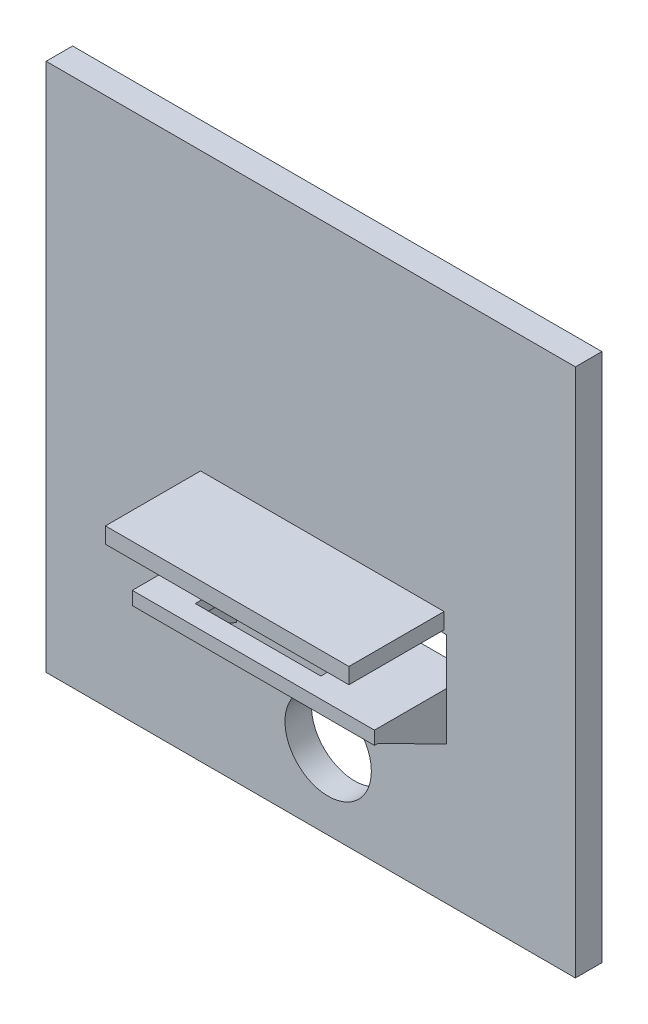
ISO-10303-21;
HEADER;
FILE_DESCRIPTION(('STEP AP214'),'2;1');
FILE_NAME('part.step','',(''),(''),'','','');
FILE_SCHEMA(('AUTOMOTIVE_DESIGN { 1 0 10303 214 1 1 1 1 }'));
ENDSEC;
DATA;
#1=APPLICATION_CONTEXT('core data for automotive mechanical design processes');
#2=APPLICATION_PROTOCOL_DEFINITION('international standard','automotive_design',2000,#1);
#3=PRODUCT_CONTEXT('',#1,'mechanical');
#4=PRODUCT('Part','Part','',(#3));
#5=PRODUCT_RELATED_PRODUCT_CATEGORY('part','',(#4));
#6=PRODUCT_DEFINITION_FORMATION('','',#4);
#7=PRODUCT_DEFINITION_CONTEXT('part definition',#1,'design');
#8=PRODUCT_DEFINITION('design','',#6,#7);
#9=PRODUCT_DEFINITION_SHAPE('','',#8);
#10=(LENGTH_UNIT() NAMED_UNIT(*) SI_UNIT(.MILLI.,.METRE.));
#11=(NAMED_UNIT(*) PLANE_ANGLE_UNIT() SI_UNIT($,.RADIAN.));
#12=(NAMED_UNIT(*) SI_UNIT($,.STERADIAN.) SOLID_ANGLE_UNIT());
#13=UNCERTAINTY_MEASURE_WITH_UNIT(LENGTH_MEASURE(1.E-05),#10,'distance_accuracy_value','');
#14=(GEOMETRIC_REPRESENTATION_CONTEXT(3) GLOBAL_UNCERTAINTY_ASSIGNED_CONTEXT((#13)) GLOBAL_UNIT_ASSIGNED_CONTEXT((#10,
#11,#12)) REPRESENTATION_CONTEXT('',''));
#15=CARTESIAN_POINT('',(0.,0.,0.));
#16=DIRECTION('',(0.,0.,1.));
#17=DIRECTION('',(1.,0.,0.));
#18=AXIS2_PLACEMENT_3D('',#15,#16,#17);
#19=CARTESIAN_POINT('',(151.640450248194,-27.3694719299466,11.2693926939187));
#20=DIRECTION('',(-1.,0.,0.));
#21=DIRECTION('',(0.,0.,1.));
#22=AXIS2_PLACEMENT_3D('',#19,#20,#21);
#23=PLANE('',#22);
#24=DIRECTION('',(0.,0.,-1.));
#25=VECTOR('',#24,1.);
#26=CARTESIAN_POINT('',(151.640450248194,-33.3694719299466,11.2693926939187));
#27=LINE('',#26,#25);
#28=CARTESIAN_POINT('',(151.640450248194,-33.3694719299466,47.2328803838877));
#29=VERTEX_POINT('',#28);
#30=CARTESIAN_POINT('',(151.640450248194,-33.3694719299466,11.2693926939187));
#31=VERTEX_POINT('',#30);
#32=EDGE_CURVE('E118',#29,#31,#27,.T.);
#33=ORIENTED_EDGE('',*,*,#32,.T.);
#34=DIRECTION('',(0.,-1.,0.));
#35=VECTOR('',#34,1.);
#36=CARTESIAN_POINT('',(151.640450248194,-27.3694719299466,11.2693926939187));
#37=LINE('',#36,#35);
#38=CARTESIAN_POINT('',(151.640450248194,-27.3694719299466,11.2693926939187));
#39=VERTEX_POINT('',#38);
#40=EDGE_CURVE('E12',#39,#31,#37,.T.);
#41=ORIENTED_EDGE('',*,*,#40,.F.);
#42=DIRECTION('',(0.,0.,-1.));
#43=VECTOR('',#42,1.);
#44=CARTESIAN_POINT('',(151.640450248194,-27.3694719299466,11.2693926939187));
#45=LINE('',#44,#43);
#46=CARTESIAN_POINT('',(151.640450248194,-27.3694719299466,47.2328803838877));
#47=VERTEX_POINT('',#46);
#48=EDGE_CURVE('E106',#47,#39,#45,.T.);
#49=ORIENTED_EDGE('',*,*,#48,.F.);
#50=DIRECTION('',(0.,-1.,0.));
#51=VECTOR('',#50,1.);
#52=CARTESIAN_POINT('',(151.640450248194,-27.3694719299466,47.2328803838877));
#53=LINE('',#52,#51);
#54=EDGE_CURVE('E114',#47,#29,#53,.T.);
#55=ORIENTED_EDGE('',*,*,#54,.T.);
#56=EDGE_LOOP('',(#33,#41,#49,#55));
#57=FACE_BOUND('',#56,.T.);
#58=ADVANCED_FACE('F55',(#57),#23,.F.);
#59=CARTESIAN_POINT('',(151.640450248194,-27.3694719299466,11.2693926939187));
#60=DIRECTION('',(0.,0.,1.));
#61=DIRECTION('',(1.,0.,0.));
#62=AXIS2_PLACEMENT_3D('',#59,#60,#61);
#63=PLANE('',#62);
#64=DIRECTION('',(-1.,0.,0.));
#65=VECTOR('',#64,1.);
#66=CARTESIAN_POINT('',(151.640450248194,-33.3694719299466,11.2693926939187));
#67=LINE('',#66,#65);
#68=CARTESIAN_POINT('',(59.6402535033151,-33.3694719299466,11.2693926939187));
#69=VERTEX_POINT('',#68);
#70=EDGE_CURVE('E110',#31,#69,#67,.T.);
#71=ORIENTED_EDGE('',*,*,#70,.T.);
#72=DIRECTION('',(0.,-1.,0.));
#73=VECTOR('',#72,1.);
#74=CARTESIAN_POINT('',(59.6402535033151,-27.3694719299466,11.2693926939187));
#75=LINE('',#74,#73);
#76=CARTESIAN_POINT('',(59.6402535033151,-27.3694719299466,11.2693926939187));
#77=VERTEX_POINT('',#76);
#78=EDGE_CURVE('E63',#77,#69,#75,.T.);
#79=ORIENTED_EDGE('',*,*,#78,.F.);
#80=DIRECTION('',(-1.,0.,0.));
#81=VECTOR('',#80,1.);
#82=CARTESIAN_POINT('',(151.640450248194,-27.3694719299466,11.2693926939187));
#83=LINE('',#82,#81);
#84=EDGE_CURVE('E101',#39,#77,#83,.T.);
#85=ORIENTED_EDGE('',*,*,#84,.F.);
#86=ORIENTED_EDGE('',*,*,#40,.T.);
#87=EDGE_LOOP('',(#71,#79,#85,#86));
#88=FACE_BOUND('',#87,.T.);
#89=ADVANCED_FACE('F109',(#88),#63,.F.);
#90=CARTESIAN_POINT('',(59.6402535033151,-27.3694719299466,11.2693926939187));
#91=DIRECTION('',(1.,0.,0.));
#92=DIRECTION('',(0.,0.,-1.));
#93=AXIS2_PLACEMENT_3D('',#90,#91,#92);
#94=PLANE('',#93);
#95=DIRECTION('',(0.,0.,1.));
#96=VECTOR('',#95,1.);
#97=CARTESIAN_POINT('',(59.6402535033151,-33.3694719299466,11.2693926939187));
#98=LINE('',#97,#96);
#99=CARTESIAN_POINT('',(59.6402535033151,-33.3694719299466,47.2328803838877));
#100=VERTEX_POINT('',#99);
#101=EDGE_CURVE('E88',#69,#100,#98,.T.);
#102=ORIENTED_EDGE('',*,*,#101,.T.);
#103=DIRECTION('',(0.,-1.,0.));
#104=VECTOR('',#103,1.);
#105=CARTESIAN_POINT('',(59.6402535033151,-27.3694719299466,47.2328803838877));
#106=LINE('',#105,#104);
#107=CARTESIAN_POINT('',(59.6402535033151,-27.3694719299466,47.2328803838877));
#108=VERTEX_POINT('',#107);
#109=EDGE_CURVE('E111',#108,#100,#106,.T.);
#110=ORIENTED_EDGE('',*,*,#109,.F.);
#111=DIRECTION('',(0.,0.,1.));
#112=VECTOR('',#111,1.);
#113=CARTESIAN_POINT('',(59.6402535033151,-27.3694719299466,11.2693926939187));
#114=LINE('',#113,#112);
#115=EDGE_CURVE('E104',#77,#108,#114,.T.);
#116=ORIENTED_EDGE('',*,*,#115,.F.);
#117=ORIENTED_EDGE('',*,*,#78,.T.);
#118=EDGE_LOOP('',(#102,#110,#116,#117));
#119=FACE_BOUND('',#118,.T.);
#120=ADVANCED_FACE('F112',(#119),#94,.F.);
#121=CARTESIAN_POINT('',(151.640450248194,-27.3694719299466,47.2328803838877));
#122=DIRECTION('',(0.,0.,-1.));
#123=DIRECTION('',(-1.,0.,0.));
#124=AXIS2_PLACEMENT_3D('',#121,#122,#123);
#125=PLANE('',#124);
#126=DIRECTION('',(1.,0.,0.));
#127=VECTOR('',#126,1.);
#128=CARTESIAN_POINT('',(151.640450248194,-33.3694719299466,47.2328803838877));
#129=LINE('',#128,#127);
#130=EDGE_CURVE('E94',#100,#29,#129,.T.);
#131=ORIENTED_EDGE('',*,*,#130,.T.);
#132=ORIENTED_EDGE('',*,*,#54,.F.);
#133=DIRECTION('',(1.,0.,0.));
#134=VECTOR('',#133,1.);
#135=CARTESIAN_POINT('',(151.640450248194,-27.3694719299466,47.2328803838877));
#136=LINE('',#135,#134);
#137=EDGE_CURVE('E71',#108,#47,#136,.T.);
#138=ORIENTED_EDGE('',*,*,#137,.F.);
#139=ORIENTED_EDGE('',*,*,#109,.T.);
#140=EDGE_LOOP('',(#131,#132,#138,#139));
#141=FACE_BOUND('',#140,.T.);
#142=ADVANCED_FACE('F125',(#141),#125,.F.);
#143=CARTESIAN_POINT('',(0.,-27.3694719299466,0.));
#144=DIRECTION('',(0.,-1.,0.));
#145=DIRECTION('',(0.,0.,-1.));
#146=AXIS2_PLACEMENT_3D('',#143,#144,#145);
#147=PLANE('',#146);
#148=ORIENTED_EDGE('',*,*,#48,.T.);
#149=ORIENTED_EDGE('',*,*,#84,.T.);
#150=ORIENTED_EDGE('',*,*,#115,.T.);
#151=ORIENTED_EDGE('',*,*,#137,.T.);
#152=EDGE_LOOP('',(#148,#149,#150,#151));
#153=FACE_BOUND('',#152,.T.);
#154=ADVANCED_FACE('F102',(#153),#147,.F.);
#155=CARTESIAN_POINT('',(0.,-33.3694719299466,0.));
#156=DIRECTION('',(0.,-1.,0.));
#157=DIRECTION('',(0.,0.,-1.));
#158=AXIS2_PLACEMENT_3D('',#155,#156,#157);
#159=PLANE('',#158);
#160=ORIENTED_EDGE('',*,*,#32,.F.);
#161=ORIENTED_EDGE('',*,*,#130,.F.);
#162=ORIENTED_EDGE('',*,*,#101,.F.);
#163=ORIENTED_EDGE('',*,*,#70,.F.);
#164=EDGE_LOOP('',(#160,#161,#162,#163));
#165=FACE_BOUND('',#164,.T.);
#166=ADVANCED_FACE('F128',(#165),#159,.T.);
#167=CLOSED_SHELL('',(#58,#89,#120,#142,#154,#166));
#168=MANIFOLD_SOLID_BREP('B2',#167);
#169=CARTESIAN_POINT('',(0.,0.,10.));
#170=DIRECTION('',(0.,0.,1.));
#171=DIRECTION('',(1.,0.,0.));
#172=AXIS2_PLACEMENT_3D('',#169,#170,#171);
#173=PLANE('',#172);
#174=DIRECTION('',(0.,1.,0.));
#175=VECTOR('',#174,1.);
#176=CARTESIAN_POINT('',(139.307336770756,-71.5705828269948,10.));
#177=LINE('',#176,#175);
#178=CARTESIAN_POINT('',(139.307336770756,-71.5705828269948,10.));
#179=VERTEX_POINT('',#178);
#180=CARTESIAN_POINT('',(139.307336770756,-58.3694719299466,10.));
#181=VERTEX_POINT('',#180);
#182=EDGE_CURVE('E336',#179,#181,#177,.T.);
#183=ORIENTED_EDGE('',*,*,#182,.T.);
#184=DIRECTION('',(1.,0.,0.));
#185=VECTOR('',#184,1.);
#186=CARTESIAN_POINT('',(59.8073367707563,-58.3694719299466,10.));
#187=LINE('',#186,#185);
#188=CARTESIAN_POINT('',(71.8455262629195,-58.3694719299466,10.));
#189=VERTEX_POINT('',#188);
#190=EDGE_CURVE('E318',#189,#181,#187,.T.);
#191=ORIENTED_EDGE('',*,*,#190,.F.);
#192=DIRECTION('',(0.,-1.,0.));
#193=VECTOR('',#192,1.);
#194=CARTESIAN_POINT('',(71.8455262629195,-71.5705828269948,10.));
#195=LINE('',#194,#193);
#196=CARTESIAN_POINT('',(71.8455262629195,-71.5705828269948,10.));
#197=VERTEX_POINT('',#196);
#198=EDGE_CURVE('E347',#189,#197,#195,.T.);
#199=ORIENTED_EDGE('',*,*,#198,.T.);
#200=DIRECTION('',(-1.,0.,0.));
#201=VECTOR('',#200,1.);
#202=CARTESIAN_POINT('',(71.8455262629195,-71.5705828269948,10.));
#203=LINE('',#202,#201);
#204=CARTESIAN_POINT('',(59.8073367707563,-71.5705828269948,10.));
#205=VERTEX_POINT('',#204);
#206=EDGE_CURVE('E354',#197,#205,#203,.T.);
#207=ORIENTED_EDGE('',*,*,#206,.T.);
#208=DIRECTION('',(0.,1.,0.));
#209=VECTOR('',#208,1.);
#210=CARTESIAN_POINT('',(59.8073367707563,-58.3694719299466,10.));
#211=LINE('',#210,#209);
#212=CARTESIAN_POINT('',(59.8073367707563,-53.3694719299466,10.));
#213=VERTEX_POINT('',#212);
#214=EDGE_CURVE('E429',#205,#213,#211,.T.);
#215=ORIENTED_EDGE('',*,*,#214,.T.);
#216=DIRECTION('',(0.,-1.,0.));
#217=VECTOR('',#216,1.);
#218=CARTESIAN_POINT('',(59.8073367707563,-35.7694719299466,10.));
#219=LINE('',#218,#217);
#220=CARTESIAN_POINT('',(59.8073367707563,-35.7694719299466,10.));
#221=VERTEX_POINT('',#220);
#222=EDGE_CURVE('E442',#221,#213,#219,.T.);
#223=ORIENTED_EDGE('',*,*,#222,.F.);
#224=DIRECTION('',(-1.,0.,0.));
#225=VECTOR('',#224,1.);
#226=CARTESIAN_POINT('',(59.8073367707563,-35.7694719299466,10.));
#227=LINE('',#226,#225);
#228=CARTESIAN_POINT('',(151.307336770756,-35.7694719299466,10.));
#229=VERTEX_POINT('',#228);
#230=EDGE_CURVE('E451',#229,#221,#227,.T.);
#231=ORIENTED_EDGE('',*,*,#230,.F.);
#232=DIRECTION('',(0.,1.,0.));
#233=VECTOR('',#232,1.);
#234=CARTESIAN_POINT('',(151.307336770756,-35.7694719299466,10.));
#235=LINE('',#234,#233);
#236=CARTESIAN_POINT('',(151.307336770756,-53.3694719299466,10.));
#237=VERTEX_POINT('',#236);
#238=EDGE_CURVE('E446',#237,#229,#235,.T.);
#239=ORIENTED_EDGE('',*,*,#238,.F.);
#240=DIRECTION('',(0.,1.,0.));
#241=VECTOR('',#240,1.);
#242=CARTESIAN_POINT('',(151.307336770756,-58.3694719299466,10.));
#243=LINE('',#242,#241);
#244=CARTESIAN_POINT('',(151.307336770756,-71.5705828269948,10.));
#245=VERTEX_POINT('',#244);
#246=EDGE_CURVE('E200',#245,#237,#243,.T.);
#247=ORIENTED_EDGE('',*,*,#246,.F.);
#248=DIRECTION('',(1.,0.,0.));
#249=VECTOR('',#248,1.);
#250=CARTESIAN_POINT('',(139.307336770756,-71.5705828269948,10.));
#251=LINE('',#250,#249);
#252=EDGE_CURVE('E195',#179,#245,#251,.T.);
#253=ORIENTED_EDGE('',*,*,#252,.F.);
#254=EDGE_LOOP('',(#183,#191,#199,#207,#215,#223,#231,#239,#247,#253));
#255=FACE_BOUND('',#254,.T.);
#256=DIRECTION('',(0.,-1.,0.));
#257=VECTOR('',#256,1.);
#258=CARTESIAN_POINT('',(0.,76.2376237623762,10.));
#259=LINE('',#258,#257);
#260=CARTESIAN_POINT('',(0.,76.2376237623762,10.));
#261=VERTEX_POINT('',#260);
#262=CARTESIAN_POINT('',(0.,-123.762376237624,10.));
#263=VERTEX_POINT('',#262);
#264=EDGE_CURVE('E483',#261,#263,#259,.T.);
#265=ORIENTED_EDGE('',*,*,#264,.T.);
#266=DIRECTION('',(1.,0.,0.));
#267=VECTOR('',#266,1.);
#268=CARTESIAN_POINT('',(0.,-123.762376237624,10.));
#269=LINE('',#268,#267);
#270=CARTESIAN_POINT('',(200.,-123.762376237624,10.));
#271=VERTEX_POINT('',#270);
#272=EDGE_CURVE('E487',#263,#271,#269,.T.);
#273=ORIENTED_EDGE('',*,*,#272,.T.);
#274=DIRECTION('',(0.,1.,0.));
#275=VECTOR('',#274,1.);
#276=CARTESIAN_POINT('',(200.,76.2376237623762,10.));
#277=LINE('',#276,#275);
#278=CARTESIAN_POINT('',(200.,76.2376237623762,10.));
#279=VERTEX_POINT('',#278);
#280=EDGE_CURVE('E491',#271,#279,#277,.T.);
#281=ORIENTED_EDGE('',*,*,#280,.T.);
#282=DIRECTION('',(-1.,0.,0.));
#283=VECTOR('',#282,1.);
#284=CARTESIAN_POINT('',(0.,76.2376237623762,10.));
#285=LINE('',#284,#283);
#286=EDGE_CURVE('E494',#279,#261,#285,.T.);
#287=ORIENTED_EDGE('',*,*,#286,.T.);
#288=EDGE_LOOP('',(#265,#273,#281,#287));
#289=FACE_BOUND('',#288,.T.);
#290=CARTESIAN_POINT('',(106.569920284479,-94.6722055149266,10.));
#291=DIRECTION('',(0.,0.,1.));
#292=DIRECTION('',(1.,0.,0.));
#293=AXIS2_PLACEMENT_3D('',#290,#291,#292);
#294=CIRCLE('',#293,16.3178180371608);
#295=CARTESIAN_POINT('',(122.887738321639,-94.6722055149266,10.));
#296=VERTEX_POINT('',#295);
#297=EDGE_CURVE('E434',#296,#296,#294,.T.);
#298=ORIENTED_EDGE('',*,*,#297,.F.);
#299=EDGE_LOOP('',(#298));
#300=FACE_BOUND('',#299,.T.);
#301=ADVANCED_FACE('F179',(#255,#289,#300),#173,.T.);
#302=CARTESIAN_POINT('',(0.,-58.3694719299466,0.));
#303=DIRECTION('',(0.,1.,0.));
#304=DIRECTION('',(0.,0.,1.));
#305=AXIS2_PLACEMENT_3D('',#302,#303,#304);
#306=PLANE('',#305);
#307=DIRECTION('',(0.,0.,-1.));
#308=VECTOR('',#307,1.);
#309=CARTESIAN_POINT('',(76.0262687192503,-58.3694719299466,29.6780609610219));
#310=LINE('',#309,#308);
#311=CARTESIAN_POINT('',(76.0262687192503,-58.3694719299466,29.6780609610219));
#312=VERTEX_POINT('',#311);
#313=CARTESIAN_POINT('',(76.0262687192503,-58.3694719299466,14.8446487357292));
#314=VERTEX_POINT('',#313);
#315=EDGE_CURVE('E366',#312,#314,#310,.T.);
#316=ORIENTED_EDGE('',*,*,#315,.F.);
#317=DIRECTION('',(-1.,0.,0.));
#318=VECTOR('',#317,1.);
#319=CARTESIAN_POINT('',(76.0262687192503,-58.3694719299466,29.6780609610219));
#320=LINE('',#319,#318);
#321=CARTESIAN_POINT('',(123.490643144786,-58.3694719299466,29.6780609610219));
#322=VERTEX_POINT('',#321);
#323=EDGE_CURVE('E377',#322,#312,#320,.T.);
#324=ORIENTED_EDGE('',*,*,#323,.F.);
#325=DIRECTION('',(0.,0.,1.));
#326=VECTOR('',#325,1.);
#327=CARTESIAN_POINT('',(123.490643144786,-58.3694719299466,29.6780609610219));
#328=LINE('',#327,#326);
#329=CARTESIAN_POINT('',(123.490643144786,-58.3694719299466,14.8446487357292));
#330=VERTEX_POINT('',#329);
#331=EDGE_CURVE('E373',#330,#322,#328,.T.);
#332=ORIENTED_EDGE('',*,*,#331,.F.);
#333=DIRECTION('',(1.,0.,0.));
#334=VECTOR('',#333,1.);
#335=CARTESIAN_POINT('',(76.0262687192503,-58.3694719299466,14.8446487357292));
#336=LINE('',#335,#334);
#337=EDGE_CURVE('E369',#314,#330,#336,.T.);
#338=ORIENTED_EDGE('',*,*,#337,.F.);
#339=EDGE_LOOP('',(#316,#324,#332,#338));
#340=FACE_BOUND('',#339,.T.);
#341=DIRECTION('',(0.,0.,1.));
#342=VECTOR('',#341,1.);
#343=CARTESIAN_POINT('',(139.307336770756,-58.3694719299466,0.));
#344=LINE('',#343,#342);
#345=CARTESIAN_POINT('',(139.307336770756,-58.3694719299466,35.8872546153632));
#346=VERTEX_POINT('',#345);
#347=EDGE_CURVE('E325',#181,#346,#344,.T.);
#348=ORIENTED_EDGE('',*,*,#347,.T.);
#349=DIRECTION('',(1.,0.,0.));
#350=VECTOR('',#349,1.);
#351=CARTESIAN_POINT('',(0.,-58.3694719299466,35.8872546153632));
#352=LINE('',#351,#350);
#353=CARTESIAN_POINT('',(151.307336770756,-58.3694719299466,35.8872546153632));
#354=VERTEX_POINT('',#353);
#355=EDGE_CURVE('E321',#346,#354,#352,.T.);
#356=ORIENTED_EDGE('',*,*,#355,.T.);
#357=DIRECTION('',(0.,0.,1.));
#358=VECTOR('',#357,1.);
#359=CARTESIAN_POINT('',(151.307336770756,-58.3694719299466,10.));
#360=LINE('',#359,#358);
#361=CARTESIAN_POINT('',(151.307336770756,-58.3694719299466,37.2442879467485));
#362=VERTEX_POINT('',#361);
#363=EDGE_CURVE('E306',#354,#362,#360,.T.);
#364=ORIENTED_EDGE('',*,*,#363,.T.);
#365=DIRECTION('',(-1.,0.,0.));
#366=VECTOR('',#365,1.);
#367=CARTESIAN_POINT('',(59.8073367707563,-58.3694719299466,37.2442879467485));
#368=LINE('',#367,#366);
#369=CARTESIAN_POINT('',(71.8455262629195,-58.3694719299466,37.2442879467485));
#370=VERTEX_POINT('',#369);
#371=EDGE_CURVE('E317',#362,#370,#368,.T.);
#372=ORIENTED_EDGE('',*,*,#371,.T.);
#373=DIRECTION('',(0.,0.,-1.));
#374=VECTOR('',#373,1.);
#375=CARTESIAN_POINT('',(71.8455262629195,-58.3694719299466,10.));
#376=LINE('',#375,#374);
#377=EDGE_CURVE('E344',#370,#189,#376,.T.);
#378=ORIENTED_EDGE('',*,*,#377,.T.);
#379=ORIENTED_EDGE('',*,*,#190,.T.);
#380=EDGE_LOOP('',(#348,#356,#364,#372,#378,#379));
#381=FACE_BOUND('',#380,.T.);
#382=ADVANCED_FACE('F322',(#340,#381),#306,.F.);
#383=CARTESIAN_POINT('',(0.,0.,0.));
#384=DIRECTION('',(0.,0.,1.));
#385=DIRECTION('',(1.,0.,0.));
#386=AXIS2_PLACEMENT_3D('',#383,#384,#385);
#387=PLANE('',#386);
#388=DIRECTION('',(0.,-1.,0.));
#389=VECTOR('',#388,1.);
#390=CARTESIAN_POINT('',(0.,76.2376237623762,0.));
#391=LINE('',#390,#389);
#392=CARTESIAN_POINT('',(0.,76.2376237623762,0.));
#393=VERTEX_POINT('',#392);
#394=CARTESIAN_POINT('',(0.,-123.762376237624,0.));
#395=VERTEX_POINT('',#394);
#396=EDGE_CURVE('E482',#393,#395,#391,.T.);
#397=ORIENTED_EDGE('',*,*,#396,.F.);
#398=DIRECTION('',(-1.,0.,0.));
#399=VECTOR('',#398,1.);
#400=CARTESIAN_POINT('',(0.,76.2376237623762,0.));
#401=LINE('',#400,#399);
#402=CARTESIAN_POINT('',(200.,76.2376237623762,0.));
#403=VERTEX_POINT('',#402);
#404=EDGE_CURVE('E488',#403,#393,#401,.T.);
#405=ORIENTED_EDGE('',*,*,#404,.F.);
#406=DIRECTION('',(0.,1.,0.));
#407=VECTOR('',#406,1.);
#408=CARTESIAN_POINT('',(200.,76.2376237623762,0.));
#409=LINE('',#408,#407);
#410=CARTESIAN_POINT('',(200.,-123.762376237624,0.));
#411=VERTEX_POINT('',#410);
#412=EDGE_CURVE('E504',#411,#403,#409,.T.);
#413=ORIENTED_EDGE('',*,*,#412,.F.);
#414=DIRECTION('',(1.,0.,0.));
#415=VECTOR('',#414,1.);
#416=CARTESIAN_POINT('',(0.,-123.762376237624,0.));
#417=LINE('',#416,#415);
#418=EDGE_CURVE('E501',#395,#411,#417,.T.);
#419=ORIENTED_EDGE('',*,*,#418,.F.);
#420=EDGE_LOOP('',(#397,#405,#413,#419));
#421=FACE_BOUND('',#420,.T.);
#422=DIRECTION('',(0.,-1.,0.));
#423=VECTOR('',#422,1.);
#424=CARTESIAN_POINT('',(59.8073367707563,-35.7694719299466,0.));
#425=LINE('',#424,#423);
#426=CARTESIAN_POINT('',(59.8073367707563,-35.7694719299466,0.));
#427=VERTEX_POINT('',#426);
#428=CARTESIAN_POINT('',(59.8073367707563,-53.3694719299466,0.));
#429=VERTEX_POINT('',#428);
#430=EDGE_CURVE('E438',#427,#429,#425,.T.);
#431=ORIENTED_EDGE('',*,*,#430,.T.);
#432=DIRECTION('',(1.,0.,0.));
#433=VECTOR('',#432,1.);
#434=CARTESIAN_POINT('',(59.8073367707563,-53.3694719299466,0.));
#435=LINE('',#434,#433);
#436=CARTESIAN_POINT('',(151.307336770756,-53.3694719299466,0.));
#437=VERTEX_POINT('',#436);
#438=EDGE_CURVE('E458',#429,#437,#435,.T.);
#439=ORIENTED_EDGE('',*,*,#438,.T.);
#440=DIRECTION('',(0.,1.,0.));
#441=VECTOR('',#440,1.);
#442=CARTESIAN_POINT('',(151.307336770756,-35.7694719299466,0.));
#443=LINE('',#442,#441);
#444=CARTESIAN_POINT('',(151.307336770756,-35.7694719299466,0.));
#445=VERTEX_POINT('',#444);
#446=EDGE_CURVE('E462',#437,#445,#443,.T.);
#447=ORIENTED_EDGE('',*,*,#446,.T.);
#448=DIRECTION('',(-1.,0.,0.));
#449=VECTOR('',#448,1.);
#450=CARTESIAN_POINT('',(59.8073367707563,-35.7694719299466,0.));
#451=LINE('',#450,#449);
#452=EDGE_CURVE('E447',#445,#427,#451,.T.);
#453=ORIENTED_EDGE('',*,*,#452,.T.);
#454=EDGE_LOOP('',(#431,#439,#447,#453));
#455=FACE_BOUND('',#454,.T.);
#456=CARTESIAN_POINT('',(106.569920284479,-94.6722055149266,0.));
#457=DIRECTION('',(0.,0.,1.));
#458=DIRECTION('',(1.,0.,0.));
#459=AXIS2_PLACEMENT_3D('',#456,#457,#458);
#460=CIRCLE('',#459,16.3178180371608);
#461=CARTESIAN_POINT('',(122.887738321639,-94.6722055149266,0.));
#462=VERTEX_POINT('',#461);
#463=EDGE_CURVE('E433',#462,#462,#460,.T.);
#464=ORIENTED_EDGE('',*,*,#463,.T.);
#465=EDGE_LOOP('',(#464));
#466=FACE_BOUND('',#465,.T.);
#467=ADVANCED_FACE('F527',(#421,#455,#466),#387,.F.);
#468=CARTESIAN_POINT('',(0.,76.2376237623762,10.));
#469=DIRECTION('',(1.,0.,0.));
#470=DIRECTION('',(0.,1.,0.));
#471=AXIS2_PLACEMENT_3D('',#468,#469,#470);
#472=PLANE('',#471);
#473=ORIENTED_EDGE('',*,*,#396,.T.);
#474=DIRECTION('',(0.,0.,-1.));
#475=VECTOR('',#474,1.);
#476=CARTESIAN_POINT('',(0.,-123.762376237624,10.));
#477=LINE('',#476,#475);
#478=EDGE_CURVE('E53',#263,#395,#477,.T.);
#479=ORIENTED_EDGE('',*,*,#478,.F.);
#480=ORIENTED_EDGE('',*,*,#264,.F.);
#481=DIRECTION('',(0.,0.,-1.));
#482=VECTOR('',#481,1.);
#483=CARTESIAN_POINT('',(0.,76.2376237623762,10.));
#484=LINE('',#483,#482);
#485=EDGE_CURVE('E497',#261,#393,#484,.T.);
#486=ORIENTED_EDGE('',*,*,#485,.T.);
#487=EDGE_LOOP('',(#473,#479,#480,#486));
#488=FACE_BOUND('',#487,.T.);
#489=ADVANCED_FACE('F181',(#488),#472,.F.);
#490=CARTESIAN_POINT('',(0.,-123.762376237624,10.));
#491=DIRECTION('',(0.,1.,0.));
#492=DIRECTION('',(0.,0.,1.));
#493=AXIS2_PLACEMENT_3D('',#490,#491,#492);
#494=PLANE('',#493);
#495=ORIENTED_EDGE('',*,*,#418,.T.);
#496=DIRECTION('',(0.,0.,-1.));
#497=VECTOR('',#496,1.);
#498=CARTESIAN_POINT('',(200.,-123.762376237624,10.));
#499=LINE('',#498,#497);
#500=EDGE_CURVE('E188',#271,#411,#499,.T.);
#501=ORIENTED_EDGE('',*,*,#500,.F.);
#502=ORIENTED_EDGE('',*,*,#272,.F.);
#503=ORIENTED_EDGE('',*,*,#478,.T.);
#504=EDGE_LOOP('',(#495,#501,#502,#503));
#505=FACE_BOUND('',#504,.T.);
#506=ADVANCED_FACE('F538',(#505),#494,.F.);
#507=CARTESIAN_POINT('',(200.,76.2376237623762,10.));
#508=DIRECTION('',(-1.,0.,0.));
#509=DIRECTION('',(0.,-1.,0.));
#510=AXIS2_PLACEMENT_3D('',#507,#508,#509);
#511=PLANE('',#510);
#512=ORIENTED_EDGE('',*,*,#412,.T.);
#513=DIRECTION('',(0.,0.,-1.));
#514=VECTOR('',#513,1.);
#515=CARTESIAN_POINT('',(200.,76.2376237623762,10.));
#516=LINE('',#515,#514);
#517=EDGE_CURVE('E512',#279,#403,#516,.T.);
#518=ORIENTED_EDGE('',*,*,#517,.F.);
#519=ORIENTED_EDGE('',*,*,#280,.F.);
#520=ORIENTED_EDGE('',*,*,#500,.T.);
#521=EDGE_LOOP('',(#512,#518,#519,#520));
#522=FACE_BOUND('',#521,.T.);
#523=ADVANCED_FACE('F521',(#522),#511,.F.);
#524=CARTESIAN_POINT('',(0.,76.2376237623762,10.));
#525=DIRECTION('',(0.,-1.,0.));
#526=DIRECTION('',(0.,0.,-1.));
#527=AXIS2_PLACEMENT_3D('',#524,#525,#526);
#528=PLANE('',#527);
#529=ORIENTED_EDGE('',*,*,#404,.T.);
#530=ORIENTED_EDGE('',*,*,#485,.F.);
#531=ORIENTED_EDGE('',*,*,#286,.F.);
#532=ORIENTED_EDGE('',*,*,#517,.T.);
#533=EDGE_LOOP('',(#529,#530,#531,#532));
#534=FACE_BOUND('',#533,.T.);
#535=ADVANCED_FACE('F531',(#534),#528,.F.);
#536=CARTESIAN_POINT('',(59.8073367707563,-35.7694719299466,10.));
#537=DIRECTION('',(1.,0.,0.));
#538=DIRECTION('',(0.,0.,-1.));
#539=AXIS2_PLACEMENT_3D('',#536,#537,#538);
#540=PLANE('',#539);
#541=ORIENTED_EDGE('',*,*,#430,.F.);
#542=DIRECTION('',(0.,0.,-1.));
#543=VECTOR('',#542,1.);
#544=CARTESIAN_POINT('',(59.8073367707563,-35.7694719299466,10.));
#545=LINE('',#544,#543);
#546=EDGE_CURVE('E454',#221,#427,#545,.T.);
#547=ORIENTED_EDGE('',*,*,#546,.F.);
#548=ORIENTED_EDGE('',*,*,#222,.T.);
#549=DIRECTION('',(0.,0.,-1.));
#550=VECTOR('',#549,1.);
#551=CARTESIAN_POINT('',(59.8073367707563,-53.3694719299466,10.));
#552=LINE('',#551,#550);
#553=EDGE_CURVE('E478',#213,#429,#552,.T.);
#554=ORIENTED_EDGE('',*,*,#553,.T.);
#555=EDGE_LOOP('',(#541,#547,#548,#554));
#556=FACE_BOUND('',#555,.T.);
#557=ADVANCED_FACE('F555',(#556),#540,.T.);
#558=CARTESIAN_POINT('',(59.8073367707563,-53.3694719299466,10.));
#559=DIRECTION('',(0.,1.,0.));
#560=DIRECTION('',(0.,0.,1.));
#561=AXIS2_PLACEMENT_3D('',#558,#559,#560);
#562=PLANE('',#561);
#563=ORIENTED_EDGE('',*,*,#438,.F.);
#564=ORIENTED_EDGE('',*,*,#553,.F.);
#565=DIRECTION('',(0.,0.,-1.));
#566=VECTOR('',#565,1.);
#567=CARTESIAN_POINT('',(59.8073367707563,-53.3694719299466,10.));
#568=LINE('',#567,#566);
#569=CARTESIAN_POINT('',(59.8073367707563,-53.3694719299466,37.2442879467485));
#570=VERTEX_POINT('',#569);
#571=EDGE_CURVE('E408',#570,#213,#568,.T.);
#572=ORIENTED_EDGE('',*,*,#571,.F.);
#573=DIRECTION('',(-1.,0.,0.));
#574=VECTOR('',#573,1.);
#575=CARTESIAN_POINT('',(59.8073367707563,-53.3694719299466,37.2442879467485));
#576=LINE('',#575,#574);
#577=CARTESIAN_POINT('',(151.307336770756,-53.3694719299466,37.2442879467485));
#578=VERTEX_POINT('',#577);
#579=EDGE_CURVE('E410',#578,#570,#576,.T.);
#580=ORIENTED_EDGE('',*,*,#579,.F.);
#581=DIRECTION('',(0.,0.,1.));
#582=VECTOR('',#581,1.);
#583=CARTESIAN_POINT('',(151.307336770756,-53.3694719299466,10.));
#584=LINE('',#583,#582);
#585=EDGE_CURVE('E417',#237,#578,#584,.T.);
#586=ORIENTED_EDGE('',*,*,#585,.F.);
#587=DIRECTION('',(0.,0.,-1.));
#588=VECTOR('',#587,1.);
#589=CARTESIAN_POINT('',(151.307336770756,-53.3694719299466,10.));
#590=LINE('',#589,#588);
#591=EDGE_CURVE('E475',#237,#437,#590,.T.);
#592=ORIENTED_EDGE('',*,*,#591,.T.);
#593=EDGE_LOOP('',(#563,#564,#572,#580,#586,#592));
#594=FACE_BOUND('',#593,.T.);
#595=DIRECTION('',(-1.,0.,0.));
#596=VECTOR('',#595,1.);
#597=CARTESIAN_POINT('',(76.0262687192503,-53.3694719299466,29.6780609610219));
#598=LINE('',#597,#596);
#599=CARTESIAN_POINT('',(123.490643144786,-53.3694719299466,29.6780609610219));
#600=VERTEX_POINT('',#599);
#601=CARTESIAN_POINT('',(76.0262687192503,-53.3694719299466,29.6780609610219));
#602=VERTEX_POINT('',#601);
#603=EDGE_CURVE('E370',#600,#602,#598,.T.);
#604=ORIENTED_EDGE('',*,*,#603,.T.);
#605=DIRECTION('',(0.,0.,-1.));
#606=VECTOR('',#605,1.);
#607=CARTESIAN_POINT('',(76.0262687192503,-53.3694719299466,29.6780609610219));
#608=LINE('',#607,#606);
#609=CARTESIAN_POINT('',(76.0262687192503,-53.3694719299466,14.8446487357292));
#610=VERTEX_POINT('',#609);
#611=EDGE_CURVE('E362',#602,#610,#608,.T.);
#612=ORIENTED_EDGE('',*,*,#611,.T.);
#613=DIRECTION('',(1.,0.,0.));
#614=VECTOR('',#613,1.);
#615=CARTESIAN_POINT('',(76.0262687192503,-53.3694719299466,14.8446487357292));
#616=LINE('',#615,#614);
#617=CARTESIAN_POINT('',(123.490643144786,-53.3694719299466,14.8446487357292));
#618=VERTEX_POINT('',#617);
#619=EDGE_CURVE('E384',#610,#618,#616,.T.);
#620=ORIENTED_EDGE('',*,*,#619,.T.);
#621=DIRECTION('',(0.,0.,1.));
#622=VECTOR('',#621,1.);
#623=CARTESIAN_POINT('',(123.490643144786,-53.3694719299466,29.6780609610219));
#624=LINE('',#623,#622);
#625=EDGE_CURVE('E388',#618,#600,#624,.T.);
#626=ORIENTED_EDGE('',*,*,#625,.T.);
#627=EDGE_LOOP('',(#604,#612,#620,#626));
#628=FACE_BOUND('',#627,.T.);
#629=ADVANCED_FACE('F564',(#594,#628),#562,.T.);
#630=CARTESIAN_POINT('',(151.307336770756,-35.7694719299466,10.));
#631=DIRECTION('',(-1.,0.,0.));
#632=DIRECTION('',(0.,0.,1.));
#633=AXIS2_PLACEMENT_3D('',#630,#631,#632);
#634=PLANE('',#633);
#635=ORIENTED_EDGE('',*,*,#446,.F.);
#636=ORIENTED_EDGE('',*,*,#591,.F.);
#637=ORIENTED_EDGE('',*,*,#238,.T.);
#638=DIRECTION('',(0.,0.,-1.));
#639=VECTOR('',#638,1.);
#640=CARTESIAN_POINT('',(151.307336770756,-35.7694719299466,10.));
#641=LINE('',#640,#639);
#642=EDGE_CURVE('E472',#229,#445,#641,.T.);
#643=ORIENTED_EDGE('',*,*,#642,.T.);
#644=EDGE_LOOP('',(#635,#636,#637,#643));
#645=FACE_BOUND('',#644,.T.);
#646=ADVANCED_FACE('F570',(#645),#634,.T.);
#647=CARTESIAN_POINT('',(59.8073367707563,-35.7694719299466,10.));
#648=DIRECTION('',(0.,-1.,0.));
#649=DIRECTION('',(0.,0.,-1.));
#650=AXIS2_PLACEMENT_3D('',#647,#648,#649);
#651=PLANE('',#650);
#652=ORIENTED_EDGE('',*,*,#452,.F.);
#653=ORIENTED_EDGE('',*,*,#642,.F.);
#654=ORIENTED_EDGE('',*,*,#230,.T.);
#655=ORIENTED_EDGE('',*,*,#546,.T.);
#656=EDGE_LOOP('',(#652,#653,#654,#655));
#657=FACE_BOUND('',#656,.T.);
#658=ADVANCED_FACE('F577',(#657),#651,.T.);
#659=CARTESIAN_POINT('',(106.569920284479,-94.6722055149266,10.));
#660=DIRECTION('',(0.,0.,-1.));
#661=DIRECTION('',(-1.,0.,0.));
#662=AXIS2_PLACEMENT_3D('',#659,#660,#661);
#663=CYLINDRICAL_SURFACE('',#662,16.3178180371608);
#664=ORIENTED_EDGE('',*,*,#297,.T.);
#665=EDGE_LOOP('',(#664));
#666=FACE_BOUND('',#665,.T.);
#667=ORIENTED_EDGE('',*,*,#463,.F.);
#668=EDGE_LOOP('',(#667));
#669=FACE_BOUND('',#668,.T.);
#670=ADVANCED_FACE('F637',(#666,#669),#663,.F.);
#671=CARTESIAN_POINT('',(59.8073367707563,-58.3694719299466,10.));
#672=DIRECTION('',(1.,0.,0.));
#673=DIRECTION('',(0.,0.,-1.));
#674=AXIS2_PLACEMENT_3D('',#671,#672,#673);
#675=PLANE('',#674);
#676=ORIENTED_EDGE('',*,*,#571,.T.);
#677=ORIENTED_EDGE('',*,*,#214,.F.);
#678=DIRECTION('',(0.,0.436053096424707,0.899920939359911));
#679=VECTOR('',#678,1.);
#680=CARTESIAN_POINT('',(59.8073367707563,-58.3694719299466,37.2442879467485));
#681=LINE('',#680,#679);
#682=CARTESIAN_POINT('',(59.8073367707563,-58.3694719299466,37.2442879467485));
#683=VERTEX_POINT('',#682);
#684=EDGE_CURVE('E329',#205,#683,#681,.T.);
#685=ORIENTED_EDGE('',*,*,#684,.T.);
#686=DIRECTION('',(0.,1.,0.));
#687=VECTOR('',#686,1.);
#688=CARTESIAN_POINT('',(59.8073367707563,-58.3694719299466,37.2442879467485));
#689=LINE('',#688,#687);
#690=EDGE_CURVE('E414',#683,#570,#689,.T.);
#691=ORIENTED_EDGE('',*,*,#690,.T.);
#692=EDGE_LOOP('',(#676,#677,#685,#691));
#693=FACE_BOUND('',#692,.T.);
#694=ADVANCED_FACE('F590',(#693),#675,.F.);
#695=CARTESIAN_POINT('',(151.307336770756,-58.3694719299466,10.));
#696=DIRECTION('',(-1.,0.,0.));
#697=DIRECTION('',(0.,0.,1.));
#698=AXIS2_PLACEMENT_3D('',#695,#696,#697);
#699=PLANE('',#698);
#700=ORIENTED_EDGE('',*,*,#363,.F.);
#701=DIRECTION('',(0.,-0.454288150479322,-0.890854800926659));
#702=VECTOR('',#701,1.);
#703=CARTESIAN_POINT('',(151.307336770756,-57.6774577413128,37.2442879467485));
#704=LINE('',#703,#702);
#705=EDGE_CURVE('E310',#354,#245,#704,.T.);
#706=ORIENTED_EDGE('',*,*,#705,.T.);
#707=ORIENTED_EDGE('',*,*,#246,.T.);
#708=ORIENTED_EDGE('',*,*,#585,.T.);
#709=DIRECTION('',(0.,1.,0.));
#710=VECTOR('',#709,1.);
#711=CARTESIAN_POINT('',(151.307336770756,-58.3694719299466,37.2442879467485));
#712=LINE('',#711,#710);
#713=EDGE_CURVE('E312',#362,#578,#712,.T.);
#714=ORIENTED_EDGE('',*,*,#713,.F.);
#715=EDGE_LOOP('',(#700,#706,#707,#708,#714));
#716=FACE_BOUND('',#715,.T.);
#717=ADVANCED_FACE('F308',(#716),#699,.F.);
#718=CARTESIAN_POINT('',(59.8073367707563,-58.3694719299466,37.2442879467485));
#719=DIRECTION('',(0.,0.,-1.));
#720=DIRECTION('',(-1.,0.,0.));
#721=AXIS2_PLACEMENT_3D('',#718,#719,#720);
#722=PLANE('',#721);
#723=ORIENTED_EDGE('',*,*,#579,.T.);
#724=ORIENTED_EDGE('',*,*,#690,.F.);
#725=DIRECTION('',(-1.,0.,0.));
#726=VECTOR('',#725,1.);
#727=CARTESIAN_POINT('',(71.8455262629195,-58.3694719299466,37.2442879467485));
#728=LINE('',#727,#726);
#729=EDGE_CURVE('E358',#370,#683,#728,.T.);
#730=ORIENTED_EDGE('',*,*,#729,.F.);
#731=ORIENTED_EDGE('',*,*,#371,.F.);
#732=ORIENTED_EDGE('',*,*,#713,.T.);
#733=EDGE_LOOP('',(#723,#724,#730,#731,#732));
#734=FACE_BOUND('',#733,.T.);
#735=ADVANCED_FACE('F588',(#734),#722,.F.);
#736=CARTESIAN_POINT('',(76.0262687192503,-58.3694719299466,29.6780609610219));
#737=DIRECTION('',(1.,0.,0.));
#738=DIRECTION('',(0.,0.,-1.));
#739=AXIS2_PLACEMENT_3D('',#736,#737,#738);
#740=PLANE('',#739);
#741=ORIENTED_EDGE('',*,*,#611,.F.);
#742=DIRECTION('',(0.,1.,0.));
#743=VECTOR('',#742,1.);
#744=CARTESIAN_POINT('',(76.0262687192503,-58.3694719299466,29.6780609610219));
#745=LINE('',#744,#743);
#746=EDGE_CURVE('E380',#312,#602,#745,.T.);
#747=ORIENTED_EDGE('',*,*,#746,.F.);
#748=ORIENTED_EDGE('',*,*,#315,.T.);
#749=DIRECTION('',(0.,1.,0.));
#750=VECTOR('',#749,1.);
#751=CARTESIAN_POINT('',(76.0262687192503,-58.3694719299466,14.8446487357292));
#752=LINE('',#751,#750);
#753=EDGE_CURVE('E404',#314,#610,#752,.T.);
#754=ORIENTED_EDGE('',*,*,#753,.T.);
#755=EDGE_LOOP('',(#741,#747,#748,#754));
#756=FACE_BOUND('',#755,.T.);
#757=ADVANCED_FACE('F626',(#756),#740,.T.);
#758=CARTESIAN_POINT('',(76.0262687192503,-58.3694719299466,14.8446487357292));
#759=DIRECTION('',(0.,0.,1.));
#760=DIRECTION('',(1.,0.,0.));
#761=AXIS2_PLACEMENT_3D('',#758,#759,#760);
#762=PLANE('',#761);
#763=ORIENTED_EDGE('',*,*,#619,.F.);
#764=ORIENTED_EDGE('',*,*,#753,.F.);
#765=ORIENTED_EDGE('',*,*,#337,.T.);
#766=DIRECTION('',(0.,1.,0.));
#767=VECTOR('',#766,1.);
#768=CARTESIAN_POINT('',(123.490643144786,-58.3694719299466,14.8446487357292));
#769=LINE('',#768,#767);
#770=EDGE_CURVE('E401',#330,#618,#769,.T.);
#771=ORIENTED_EDGE('',*,*,#770,.T.);
#772=EDGE_LOOP('',(#763,#764,#765,#771));
#773=FACE_BOUND('',#772,.T.);
#774=ADVANCED_FACE('F622',(#773),#762,.T.);
#775=CARTESIAN_POINT('',(123.490643144786,-58.3694719299466,29.6780609610219));
#776=DIRECTION('',(-1.,0.,0.));
#777=DIRECTION('',(0.,0.,1.));
#778=AXIS2_PLACEMENT_3D('',#775,#776,#777);
#779=PLANE('',#778);
#780=ORIENTED_EDGE('',*,*,#625,.F.);
#781=ORIENTED_EDGE('',*,*,#770,.F.);
#782=ORIENTED_EDGE('',*,*,#331,.T.);
#783=DIRECTION('',(0.,1.,0.));
#784=VECTOR('',#783,1.);
#785=CARTESIAN_POINT('',(123.490643144786,-58.3694719299466,29.6780609610219));
#786=LINE('',#785,#784);
#787=EDGE_CURVE('E398',#322,#600,#786,.T.);
#788=ORIENTED_EDGE('',*,*,#787,.T.);
#789=EDGE_LOOP('',(#780,#781,#782,#788));
#790=FACE_BOUND('',#789,.T.);
#791=ADVANCED_FACE('F618',(#790),#779,.T.);
#792=CARTESIAN_POINT('',(76.0262687192503,-58.3694719299466,29.6780609610219));
#793=DIRECTION('',(0.,0.,-1.));
#794=DIRECTION('',(-1.,0.,0.));
#795=AXIS2_PLACEMENT_3D('',#792,#793,#794);
#796=PLANE('',#795);
#797=ORIENTED_EDGE('',*,*,#603,.F.);
#798=ORIENTED_EDGE('',*,*,#787,.F.);
#799=ORIENTED_EDGE('',*,*,#323,.T.);
#800=ORIENTED_EDGE('',*,*,#746,.T.);
#801=EDGE_LOOP('',(#797,#798,#799,#800));
#802=FACE_BOUND('',#801,.T.);
#803=ADVANCED_FACE('F615',(#802),#796,.T.);
#804=CARTESIAN_POINT('',(71.8455262629195,-58.3694719299466,37.2442879467485));
#805=DIRECTION('',(0.,-0.899920939359911,0.436053096424707));
#806=DIRECTION('',(0.,-0.436053096424707,-0.899920939359911));
#807=AXIS2_PLACEMENT_3D('',#804,#805,#806);
#808=PLANE('',#807);
#809=ORIENTED_EDGE('',*,*,#684,.F.);
#810=ORIENTED_EDGE('',*,*,#206,.F.);
#811=DIRECTION('',(0.,0.436053096424707,0.899920939359911));
#812=VECTOR('',#811,1.);
#813=CARTESIAN_POINT('',(71.8455262629195,-58.3694719299466,37.2442879467485));
#814=LINE('',#813,#812);
#815=EDGE_CURVE('E350',#197,#370,#814,.T.);
#816=ORIENTED_EDGE('',*,*,#815,.T.);
#817=ORIENTED_EDGE('',*,*,#729,.T.);
#818=EDGE_LOOP('',(#809,#810,#816,#817));
#819=FACE_BOUND('',#818,.T.);
#820=ADVANCED_FACE('F594',(#819),#808,.T.);
#821=CARTESIAN_POINT('',(71.8455262629195,0.,0.));
#822=DIRECTION('',(-1.,0.,0.));
#823=DIRECTION('',(0.,0.,1.));
#824=AXIS2_PLACEMENT_3D('',#821,#822,#823);
#825=PLANE('',#824);
#826=ORIENTED_EDGE('',*,*,#377,.F.);
#827=ORIENTED_EDGE('',*,*,#815,.F.);
#828=ORIENTED_EDGE('',*,*,#198,.F.);
#829=EDGE_LOOP('',(#826,#827,#828));
#830=FACE_BOUND('',#829,.T.);
#831=ADVANCED_FACE('F600',(#830),#825,.F.);
#832=CARTESIAN_POINT('',(139.307336770756,-57.6774577413128,37.2442879467485));
#833=DIRECTION('',(0.,-0.890854800926659,0.454288150479322));
#834=DIRECTION('',(0.,-0.454288150479322,-0.890854800926659));
#835=AXIS2_PLACEMENT_3D('',#832,#833,#834);
#836=PLANE('',#835);
#837=ORIENTED_EDGE('',*,*,#355,.F.);
#838=DIRECTION('',(0.,-0.454288150479322,-0.890854800926659));
#839=VECTOR('',#838,1.);
#840=CARTESIAN_POINT('',(139.307336770756,-57.6774577413128,37.2442879467485));
#841=LINE('',#840,#839);
#842=EDGE_CURVE('E333',#346,#179,#841,.T.);
#843=ORIENTED_EDGE('',*,*,#842,.T.);
#844=ORIENTED_EDGE('',*,*,#252,.T.);
#845=ORIENTED_EDGE('',*,*,#705,.F.);
#846=EDGE_LOOP('',(#837,#843,#844,#845));
#847=FACE_BOUND('',#846,.T.);
#848=ADVANCED_FACE('F331',(#847),#836,.T.);
#849=CARTESIAN_POINT('',(139.307336770756,0.,0.));
#850=DIRECTION('',(-1.,0.,0.));
#851=DIRECTION('',(0.,0.,1.));
#852=AXIS2_PLACEMENT_3D('',#849,#850,#851);
#853=PLANE('',#852);
#854=ORIENTED_EDGE('',*,*,#347,.F.);
#855=ORIENTED_EDGE('',*,*,#182,.F.);
#856=ORIENTED_EDGE('',*,*,#842,.F.);
#857=EDGE_LOOP('',(#854,#855,#856));
#858=FACE_BOUND('',#857,.T.);
#859=ADVANCED_FACE('F603',(#858),#853,.T.);
#860=CLOSED_SHELL('',(#301,#382,#467,#489,#506,#523,#535,#557,#629,#646,#658,#670,#694,#717,
#735,#757,#774,#791,#803,#820,#831,#848,#859));
#861=MANIFOLD_SOLID_BREP('B6',#860);
#862=ADVANCED_BREP_SHAPE_REPRESENTATION('',(#18,#168,#861),#14);
#863=SHAPE_DEFINITION_REPRESENTATION(#9,#862);
ENDSEC;
END-ISO-10303-21;
